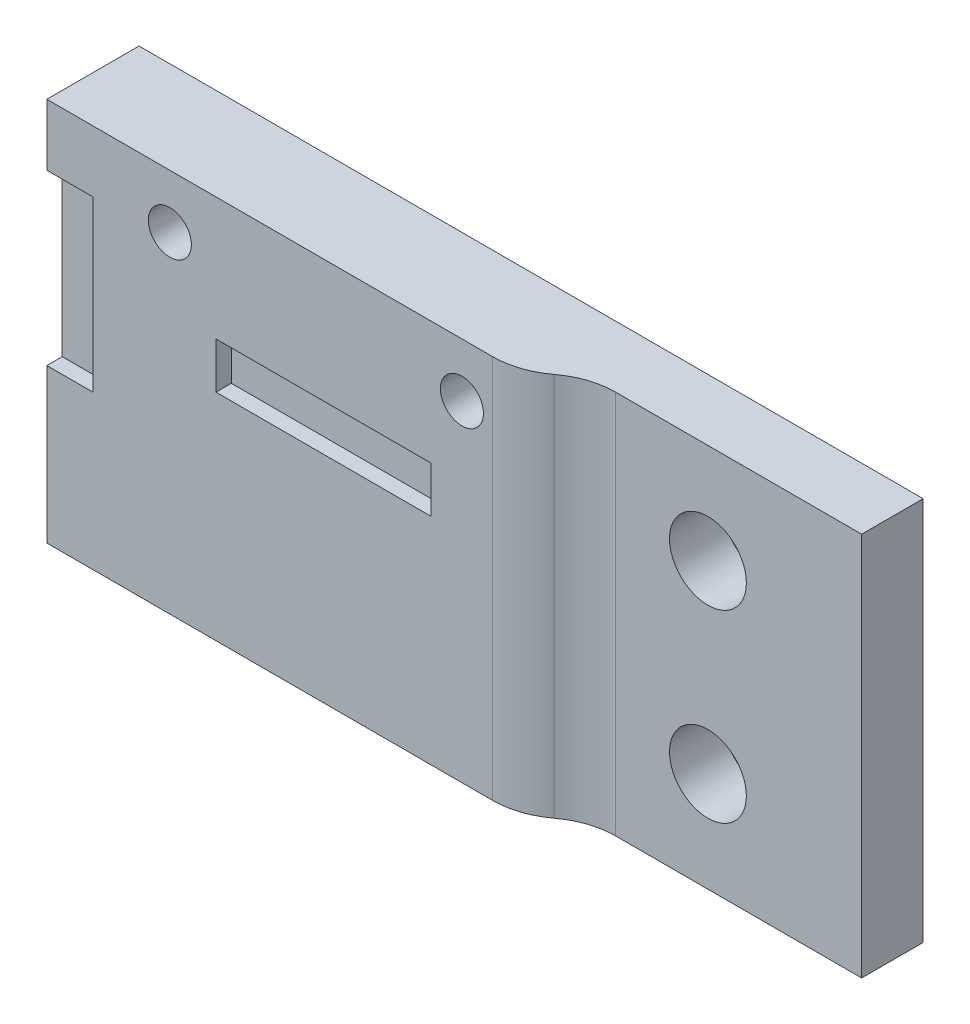
ISO-10303-21;
HEADER;
FILE_DESCRIPTION(('STEP AP214'),'2;1');
FILE_NAME('part.step','',(''),(''),'','','');
FILE_SCHEMA(('AUTOMOTIVE_DESIGN { 1 0 10303 214 1 1 1 1 }'));
ENDSEC;
DATA;
#1=APPLICATION_CONTEXT('core data for automotive mechanical design processes');
#2=APPLICATION_PROTOCOL_DEFINITION('international standard','automotive_design',2000,#1);
#3=PRODUCT_CONTEXT('',#1,'mechanical');
#4=PRODUCT('Part','Part','',(#3));
#5=PRODUCT_RELATED_PRODUCT_CATEGORY('part','',(#4));
#6=PRODUCT_DEFINITION_FORMATION('','',#4);
#7=PRODUCT_DEFINITION_CONTEXT('part definition',#1,'design');
#8=PRODUCT_DEFINITION('design','',#6,#7);
#9=PRODUCT_DEFINITION_SHAPE('','',#8);
#10=(LENGTH_UNIT() NAMED_UNIT(*) SI_UNIT(.MILLI.,.METRE.));
#11=(NAMED_UNIT(*) PLANE_ANGLE_UNIT() SI_UNIT($,.RADIAN.));
#12=(NAMED_UNIT(*) SI_UNIT($,.STERADIAN.) SOLID_ANGLE_UNIT());
#13=UNCERTAINTY_MEASURE_WITH_UNIT(LENGTH_MEASURE(1.E-05),#10,'distance_accuracy_value','');
#14=(GEOMETRIC_REPRESENTATION_CONTEXT(3) GLOBAL_UNCERTAINTY_ASSIGNED_CONTEXT((#13)) GLOBAL_UNIT_ASSIGNED_CONTEXT((#10,
#11,#12)) REPRESENTATION_CONTEXT('',''));
#15=CARTESIAN_POINT('',(0.,0.,0.));
#16=DIRECTION('',(0.,0.,1.));
#17=DIRECTION('',(1.,0.,0.));
#18=AXIS2_PLACEMENT_3D('',#15,#16,#17);
#19=CARTESIAN_POINT('',(0.,0.,0.));
#20=DIRECTION('',(0.,0.,-1.));
#21=DIRECTION('',(-1.,0.,0.));
#22=AXIS2_PLACEMENT_3D('',#19,#20,#21);
#23=PLANE('',#22);
#24=DIRECTION('',(1.,0.,0.));
#25=VECTOR('',#24,1.);
#26=CARTESIAN_POINT('',(-20.,-12.5,0.));
#27=LINE('',#26,#25);
#28=CARTESIAN_POINT('',(-11.,-12.5,0.));
#29=VERTEX_POINT('',#28);
#30=CARTESIAN_POINT('',(40.,-12.5,0.));
#31=VERTEX_POINT('',#30);
#32=EDGE_CURVE('E196',#29,#31,#27,.T.);
#33=ORIENTED_EDGE('',*,*,#32,.F.);
#34=DIRECTION('',(0.,1.,0.));
#35=VECTOR('',#34,1.);
#36=CARTESIAN_POINT('',(-11.,12.5,0.));
#37=LINE('',#36,#35);
#38=CARTESIAN_POINT('',(-11.,12.5,0.));
#39=VERTEX_POINT('',#38);
#40=EDGE_CURVE('E200',#29,#39,#37,.T.);
#41=ORIENTED_EDGE('',*,*,#40,.T.);
#42=DIRECTION('',(-1.,0.,0.));
#43=VECTOR('',#42,1.);
#44=CARTESIAN_POINT('',(-20.,12.5,0.));
#45=LINE('',#44,#43);
#46=CARTESIAN_POINT('',(40.,12.5,0.));
#47=VERTEX_POINT('',#46);
#48=EDGE_CURVE('E264',#47,#39,#45,.T.);
#49=ORIENTED_EDGE('',*,*,#48,.F.);
#50=DIRECTION('',(0.,1.,0.));
#51=VECTOR('',#50,1.);
#52=CARTESIAN_POINT('',(40.,12.5,0.));
#53=LINE('',#52,#51);
#54=EDGE_CURVE('E189',#31,#47,#53,.T.);
#55=ORIENTED_EDGE('',*,*,#54,.F.);
#56=EDGE_LOOP('',(#33,#41,#49,#55));
#57=FACE_BOUND('',#56,.T.);
#58=CARTESIAN_POINT('',(-2.99999999999997,9.,0.));
#59=DIRECTION('',(0.,0.,1.));
#60=DIRECTION('',(1.,0.,0.));
#61=AXIS2_PLACEMENT_3D('',#58,#59,#60);
#62=CIRCLE('',#61,1.4);
#63=CARTESIAN_POINT('',(-1.59999999999997,9.,0.));
#64=VERTEX_POINT('',#63);
#65=EDGE_CURVE('E228',#64,#64,#62,.T.);
#66=ORIENTED_EDGE('',*,*,#65,.T.);
#67=EDGE_LOOP('',(#66));
#68=FACE_BOUND('',#67,.T.);
#69=CARTESIAN_POINT('',(16.,9.,0.));
#70=DIRECTION('',(0.,0.,1.));
#71=DIRECTION('',(1.,0.,0.));
#72=AXIS2_PLACEMENT_3D('',#69,#70,#71);
#73=CIRCLE('',#72,1.4);
#74=CARTESIAN_POINT('',(17.4,9.,0.));
#75=VERTEX_POINT('',#74);
#76=EDGE_CURVE('E224',#75,#75,#73,.T.);
#77=ORIENTED_EDGE('',*,*,#76,.T.);
#78=EDGE_LOOP('',(#77));
#79=FACE_BOUND('',#78,.T.);
#80=CARTESIAN_POINT('',(26.4521410112089,-0.0342933799786366,0.));
#81=DIRECTION('',(0.,0.,-1.));
#82=DIRECTION('',(-1.,0.,0.));
#83=AXIS2_PLACEMENT_3D('',#80,#81,#82);
#84=CIRCLE('',#83,1.);
#85=CARTESIAN_POINT('',(26.9589780096076,0.827748531446883,0.));
#86=VERTEX_POINT('',#85);
#87=CARTESIAN_POINT('',(27.4515528202694,0.,0.));
#88=VERTEX_POINT('',#87);
#89=EDGE_CURVE('E321',#86,#88,#84,.T.);
#90=ORIENTED_EDGE('',*,*,#89,.T.);
#91=CARTESIAN_POINT('',(26.4521410112089,0.0342933799786348,0.));
#92=DIRECTION('',(0.,0.,-1.));
#93=DIRECTION('',(-1.,0.,0.));
#94=AXIS2_PLACEMENT_3D('',#91,#92,#93);
#95=CIRCLE('',#94,1.);
#96=CARTESIAN_POINT('',(26.9589780096076,-0.827748531446884,0.));
#97=VERTEX_POINT('',#96);
#98=EDGE_CURVE('E323',#88,#97,#95,.T.);
#99=ORIENTED_EDGE('',*,*,#98,.T.);
#100=CARTESIAN_POINT('',(30.,-6.,0.));
#101=DIRECTION('',(0.,0.,1.));
#102=DIRECTION('',(1.,0.,0.));
#103=AXIS2_PLACEMENT_3D('',#100,#101,#102);
#104=CIRCLE('',#103,6.);
#105=CARTESIAN_POINT('',(33.107908902421,-0.867661132168676,0.));
#106=VERTEX_POINT('',#105);
#107=EDGE_CURVE('E427',#97,#106,#104,.T.);
#108=ORIENTED_EDGE('',*,*,#107,.T.);
#109=CARTESIAN_POINT('',(33.6258937194912,-0.0122713208634525,0.));
#110=DIRECTION('',(0.,0.,-1.));
#111=DIRECTION('',(-1.,0.,0.));
#112=AXIS2_PLACEMENT_3D('',#109,#110,#111);
#113=CIRCLE('',#112,1.);
#114=CARTESIAN_POINT('',(32.6258937194912,-0.0122713208634525,0.));
#115=VERTEX_POINT('',#114);
#116=EDGE_CURVE('E319',#106,#115,#113,.T.);
#117=ORIENTED_EDGE('',*,*,#116,.T.);
#118=DIRECTION('',(0.,1.,0.));
#119=VECTOR('',#118,1.);
#120=CARTESIAN_POINT('',(32.6258937194912,0.0582838720762993,0.));
#121=LINE('',#120,#119);
#122=CARTESIAN_POINT('',(32.6258937194912,0.0122713208634533,0.));
#123=VERTEX_POINT('',#122);
#124=EDGE_CURVE('E424',#115,#123,#121,.T.);
#125=ORIENTED_EDGE('',*,*,#124,.T.);
#126=CARTESIAN_POINT('',(33.6258937194912,0.0122713208634533,0.));
#127=DIRECTION('',(0.,0.,-1.));
#128=DIRECTION('',(-1.,0.,0.));
#129=AXIS2_PLACEMENT_3D('',#126,#127,#128);
#130=CIRCLE('',#129,1.);
#131=CARTESIAN_POINT('',(33.107908902421,0.867661132168673,0.));
#132=VERTEX_POINT('',#131);
#133=EDGE_CURVE('E304',#123,#132,#130,.T.);
#134=ORIENTED_EDGE('',*,*,#133,.T.);
#135=CARTESIAN_POINT('',(30.,6.,0.));
#136=DIRECTION('',(0.,0.,1.));
#137=DIRECTION('',(1.,0.,0.));
#138=AXIS2_PLACEMENT_3D('',#135,#136,#137);
#139=CIRCLE('',#138,6.);
#140=EDGE_CURVE('E351',#132,#86,#139,.T.);
#141=ORIENTED_EDGE('',*,*,#140,.T.);
#142=EDGE_LOOP('',(#90,#99,#108,#117,#125,#134,#141));
#143=FACE_BOUND('',#142,.T.);
#144=ADVANCED_FACE('F32',(#57,#68,#79,#143),#23,.T.);
#145=CARTESIAN_POINT('',(-20.,12.5,6.));
#146=DIRECTION('',(0.,-1.,0.));
#147=DIRECTION('',(0.,0.,-1.));
#148=AXIS2_PLACEMENT_3D('',#145,#146,#147);
#149=PLANE('',#148);
#150=DIRECTION('',(-1.,0.,0.));
#151=VECTOR('',#150,1.);
#152=CARTESIAN_POINT('',(-20.,12.5,6.));
#153=LINE('',#152,#151);
#154=CARTESIAN_POINT('',(18.,12.5,6.));
#155=VERTEX_POINT('',#154);
#156=CARTESIAN_POINT('',(-11.,12.5,6.));
#157=VERTEX_POINT('',#156);
#158=EDGE_CURVE('E299',#155,#157,#153,.T.);
#159=ORIENTED_EDGE('',*,*,#158,.F.);
#160=CARTESIAN_POINT('',(18.,12.5,1.));
#161=DIRECTION('',(0.,-1.,0.));
#162=DIRECTION('',(0.,0.,-1.));
#163=AXIS2_PLACEMENT_3D('',#160,#161,#162);
#164=CIRCLE('',#163,5.);
#165=CARTESIAN_POINT('',(21.,12.5,5.));
#166=VERTEX_POINT('',#165);
#167=EDGE_CURVE('E54',#155,#166,#164,.F.);
#168=ORIENTED_EDGE('',*,*,#167,.T.);
#169=CARTESIAN_POINT('',(24.,12.5,9.));
#170=DIRECTION('',(0.,-1.,0.));
#171=DIRECTION('',(0.,0.,-1.));
#172=AXIS2_PLACEMENT_3D('',#169,#170,#171);
#173=CIRCLE('',#172,5.);
#174=CARTESIAN_POINT('',(24.,12.5,4.));
#175=VERTEX_POINT('',#174);
#176=EDGE_CURVE('E355',#166,#175,#173,.T.);
#177=ORIENTED_EDGE('',*,*,#176,.T.);
#178=DIRECTION('',(-1.,0.,0.));
#179=VECTOR('',#178,1.);
#180=CARTESIAN_POINT('',(20.,12.5,4.));
#181=LINE('',#180,#179);
#182=CARTESIAN_POINT('',(40.,12.5,4.));
#183=VERTEX_POINT('',#182);
#184=EDGE_CURVE('E206',#183,#175,#181,.T.);
#185=ORIENTED_EDGE('',*,*,#184,.F.);
#186=DIRECTION('',(0.,0.,-1.));
#187=VECTOR('',#186,1.);
#188=CARTESIAN_POINT('',(40.,12.5,4.));
#189=LINE('',#188,#187);
#190=EDGE_CURVE('E201',#183,#47,#189,.T.);
#191=ORIENTED_EDGE('',*,*,#190,.T.);
#192=ORIENTED_EDGE('',*,*,#48,.T.);
#193=DIRECTION('',(0.,0.,-1.));
#194=VECTOR('',#193,1.);
#195=CARTESIAN_POINT('',(-11.,12.5,21.));
#196=LINE('',#195,#194);
#197=EDGE_CURVE('E216',#157,#39,#196,.T.);
#198=ORIENTED_EDGE('',*,*,#197,.F.);
#199=EDGE_LOOP('',(#159,#168,#177,#185,#191,#192,#198));
#200=FACE_BOUND('',#199,.T.);
#201=ADVANCED_FACE('F369',(#200),#149,.F.);
#202=CARTESIAN_POINT('',(-20.,-12.5,6.));
#203=DIRECTION('',(0.,1.,0.));
#204=DIRECTION('',(0.,0.,1.));
#205=AXIS2_PLACEMENT_3D('',#202,#203,#204);
#206=PLANE('',#205);
#207=CARTESIAN_POINT('',(24.,-12.5,9.));
#208=DIRECTION('',(0.,1.,0.));
#209=DIRECTION('',(0.,0.,1.));
#210=AXIS2_PLACEMENT_3D('',#207,#208,#209);
#211=CIRCLE('',#210,5.);
#212=CARTESIAN_POINT('',(24.,-12.5,4.));
#213=VERTEX_POINT('',#212);
#214=CARTESIAN_POINT('',(21.,-12.5,5.));
#215=VERTEX_POINT('',#214);
#216=EDGE_CURVE('E353',#213,#215,#211,.T.);
#217=ORIENTED_EDGE('',*,*,#216,.T.);
#218=CARTESIAN_POINT('',(18.,-12.5,1.));
#219=DIRECTION('',(0.,1.,0.));
#220=DIRECTION('',(0.,0.,1.));
#221=AXIS2_PLACEMENT_3D('',#218,#219,#220);
#222=CIRCLE('',#221,5.);
#223=CARTESIAN_POINT('',(18.,-12.5,6.));
#224=VERTEX_POINT('',#223);
#225=EDGE_CURVE('E11',#215,#224,#222,.F.);
#226=ORIENTED_EDGE('',*,*,#225,.T.);
#227=DIRECTION('',(1.,0.,0.));
#228=VECTOR('',#227,1.);
#229=CARTESIAN_POINT('',(-20.,-12.5,6.));
#230=LINE('',#229,#228);
#231=CARTESIAN_POINT('',(-11.,-12.5,6.));
#232=VERTEX_POINT('',#231);
#233=EDGE_CURVE('E301',#232,#224,#230,.T.);
#234=ORIENTED_EDGE('',*,*,#233,.F.);
#235=DIRECTION('',(0.,0.,-1.));
#236=VECTOR('',#235,1.);
#237=CARTESIAN_POINT('',(-11.,-12.5,21.));
#238=LINE('',#237,#236);
#239=EDGE_CURVE('E218',#232,#29,#238,.T.);
#240=ORIENTED_EDGE('',*,*,#239,.T.);
#241=ORIENTED_EDGE('',*,*,#32,.T.);
#242=DIRECTION('',(0.,0.,-1.));
#243=VECTOR('',#242,1.);
#244=CARTESIAN_POINT('',(40.,-12.5,4.));
#245=LINE('',#244,#243);
#246=CARTESIAN_POINT('',(40.,-12.5,4.));
#247=VERTEX_POINT('',#246);
#248=EDGE_CURVE('E192',#247,#31,#245,.T.);
#249=ORIENTED_EDGE('',*,*,#248,.F.);
#250=DIRECTION('',(1.,0.,0.));
#251=VECTOR('',#250,1.);
#252=CARTESIAN_POINT('',(20.,-12.5,4.));
#253=LINE('',#252,#251);
#254=EDGE_CURVE('E179',#213,#247,#253,.T.);
#255=ORIENTED_EDGE('',*,*,#254,.F.);
#256=EDGE_LOOP('',(#217,#226,#234,#240,#241,#249,#255));
#257=FACE_BOUND('',#256,.T.);
#258=ADVANCED_FACE('F193',(#257),#206,.F.);
#259=CARTESIAN_POINT('',(0.,0.,6.));
#260=DIRECTION('',(0.,0.,-1.));
#261=DIRECTION('',(-1.,0.,0.));
#262=AXIS2_PLACEMENT_3D('',#259,#260,#261);
#263=PLANE('',#262);
#264=DIRECTION('',(0.,-1.,0.));
#265=VECTOR('',#264,1.);
#266=CARTESIAN_POINT('',(0.,0.,6.));
#267=LINE('',#266,#265);
#268=CARTESIAN_POINT('',(0.,4.5,6.));
#269=VERTEX_POINT('',#268);
#270=CARTESIAN_POINT('',(0.,1.5,6.));
#271=VERTEX_POINT('',#270);
#272=EDGE_CURVE('E253',#269,#271,#267,.T.);
#273=ORIENTED_EDGE('',*,*,#272,.F.);
#274=DIRECTION('',(-1.,0.,0.));
#275=VECTOR('',#274,1.);
#276=CARTESIAN_POINT('',(0.,4.5,6.));
#277=LINE('',#276,#275);
#278=CARTESIAN_POINT('',(14.,4.5,6.));
#279=VERTEX_POINT('',#278);
#280=EDGE_CURVE('E251',#279,#269,#277,.T.);
#281=ORIENTED_EDGE('',*,*,#280,.F.);
#282=DIRECTION('',(0.,1.,0.));
#283=VECTOR('',#282,1.);
#284=CARTESIAN_POINT('',(14.,0.,6.));
#285=LINE('',#284,#283);
#286=CARTESIAN_POINT('',(14.,1.5,6.));
#287=VERTEX_POINT('',#286);
#288=EDGE_CURVE('E241',#287,#279,#285,.T.);
#289=ORIENTED_EDGE('',*,*,#288,.F.);
#290=DIRECTION('',(1.,0.,0.));
#291=VECTOR('',#290,1.);
#292=CARTESIAN_POINT('',(0.,1.5,6.));
#293=LINE('',#292,#291);
#294=EDGE_CURVE('E257',#271,#287,#293,.T.);
#295=ORIENTED_EDGE('',*,*,#294,.F.);
#296=EDGE_LOOP('',(#273,#281,#289,#295));
#297=FACE_BOUND('',#296,.T.);
#298=CARTESIAN_POINT('',(-2.99999999999997,9.,6.));
#299=DIRECTION('',(0.,0.,-1.));
#300=DIRECTION('',(-1.,0.,0.));
#301=AXIS2_PLACEMENT_3D('',#298,#299,#300);
#302=CIRCLE('',#301,1.4);
#303=CARTESIAN_POINT('',(-4.39999999999997,9.,6.));
#304=VERTEX_POINT('',#303);
#305=EDGE_CURVE('E227',#304,#304,#302,.F.);
#306=ORIENTED_EDGE('',*,*,#305,.F.);
#307=EDGE_LOOP('',(#306));
#308=FACE_BOUND('',#307,.T.);
#309=CARTESIAN_POINT('',(16.,9.,6.));
#310=DIRECTION('',(0.,0.,-1.));
#311=DIRECTION('',(-1.,0.,0.));
#312=AXIS2_PLACEMENT_3D('',#309,#310,#311);
#313=CIRCLE('',#312,1.4);
#314=CARTESIAN_POINT('',(14.6,9.,6.));
#315=VERTEX_POINT('',#314);
#316=EDGE_CURVE('E233',#315,#315,#313,.F.);
#317=ORIENTED_EDGE('',*,*,#316,.F.);
#318=EDGE_LOOP('',(#317));
#319=FACE_BOUND('',#318,.T.);
#320=ORIENTED_EDGE('',*,*,#233,.T.);
#321=DIRECTION('',(0.,-1.,0.));
#322=VECTOR('',#321,1.);
#323=CARTESIAN_POINT('',(18.,0.,6.));
#324=LINE('',#323,#322);
#325=EDGE_CURVE('E357',#224,#155,#324,.F.);
#326=ORIENTED_EDGE('',*,*,#325,.T.);
#327=ORIENTED_EDGE('',*,*,#158,.T.);
#328=DIRECTION('',(0.,1.,0.));
#329=VECTOR('',#328,1.);
#330=CARTESIAN_POINT('',(-11.,0.,6.));
#331=LINE('',#330,#329);
#332=CARTESIAN_POINT('',(-11.,8.5,6.));
#333=VERTEX_POINT('',#332);
#334=EDGE_CURVE('E220',#333,#157,#331,.T.);
#335=ORIENTED_EDGE('',*,*,#334,.F.);
#336=DIRECTION('',(-1.,0.,0.));
#337=VECTOR('',#336,1.);
#338=CARTESIAN_POINT('',(0.,8.5,6.));
#339=LINE('',#338,#337);
#340=CARTESIAN_POINT('',(-8.,8.5,6.));
#341=VERTEX_POINT('',#340);
#342=EDGE_CURVE('E286',#341,#333,#339,.T.);
#343=ORIENTED_EDGE('',*,*,#342,.F.);
#344=DIRECTION('',(0.,1.,0.));
#345=VECTOR('',#344,1.);
#346=CARTESIAN_POINT('',(-8.,0.,6.));
#347=LINE('',#346,#345);
#348=CARTESIAN_POINT('',(-8.,-2.5,6.));
#349=VERTEX_POINT('',#348);
#350=EDGE_CURVE('E236',#349,#341,#347,.T.);
#351=ORIENTED_EDGE('',*,*,#350,.F.);
#352=DIRECTION('',(1.,0.,0.));
#353=VECTOR('',#352,1.);
#354=CARTESIAN_POINT('',(0.,-2.5,6.));
#355=LINE('',#354,#353);
#356=CARTESIAN_POINT('',(-11.,-2.5,6.));
#357=VERTEX_POINT('',#356);
#358=EDGE_CURVE('E275',#357,#349,#355,.T.);
#359=ORIENTED_EDGE('',*,*,#358,.F.);
#360=EDGE_CURVE('E223',#232,#357,#331,.T.);
#361=ORIENTED_EDGE('',*,*,#360,.F.);
#362=EDGE_LOOP('',(#320,#326,#327,#335,#343,#351,#359,#361));
#363=FACE_BOUND('',#362,.T.);
#364=ADVANCED_FACE('F362',(#297,#308,#319,#363),#263,.F.);
#365=CARTESIAN_POINT('',(-8.,0.,5.));
#366=DIRECTION('',(1.,0.,0.));
#367=DIRECTION('',(0.,1.,0.));
#368=AXIS2_PLACEMENT_3D('',#365,#366,#367);
#369=PLANE('',#368);
#370=ORIENTED_EDGE('',*,*,#350,.T.);
#371=DIRECTION('',(0.,0.,1.));
#372=VECTOR('',#371,1.);
#373=CARTESIAN_POINT('',(-8.,8.5,5.));
#374=LINE('',#373,#372);
#375=CARTESIAN_POINT('',(-8.,8.5,5.));
#376=VERTEX_POINT('',#375);
#377=EDGE_CURVE('E284',#376,#341,#374,.T.);
#378=ORIENTED_EDGE('',*,*,#377,.F.);
#379=DIRECTION('',(0.,1.,0.));
#380=VECTOR('',#379,1.);
#381=CARTESIAN_POINT('',(-8.,0.,5.));
#382=LINE('',#381,#380);
#383=CARTESIAN_POINT('',(-8.,-2.5,5.));
#384=VERTEX_POINT('',#383);
#385=EDGE_CURVE('E271',#384,#376,#382,.T.);
#386=ORIENTED_EDGE('',*,*,#385,.F.);
#387=DIRECTION('',(0.,0.,1.));
#388=VECTOR('',#387,1.);
#389=CARTESIAN_POINT('',(-8.,-2.5,5.));
#390=LINE('',#389,#388);
#391=EDGE_CURVE('E254',#384,#349,#390,.T.);
#392=ORIENTED_EDGE('',*,*,#391,.T.);
#393=EDGE_LOOP('',(#370,#378,#386,#392));
#394=FACE_BOUND('',#393,.T.);
#395=ADVANCED_FACE('F494',(#394),#369,.F.);
#396=CARTESIAN_POINT('',(0.,-2.5,5.));
#397=DIRECTION('',(0.,-1.,0.));
#398=DIRECTION('',(0.,0.,-1.));
#399=AXIS2_PLACEMENT_3D('',#396,#397,#398);
#400=PLANE('',#399);
#401=ORIENTED_EDGE('',*,*,#358,.T.);
#402=ORIENTED_EDGE('',*,*,#391,.F.);
#403=DIRECTION('',(1.,0.,0.));
#404=VECTOR('',#403,1.);
#405=CARTESIAN_POINT('',(0.,-2.5,5.));
#406=LINE('',#405,#404);
#407=CARTESIAN_POINT('',(-11.,-2.5,5.));
#408=VERTEX_POINT('',#407);
#409=EDGE_CURVE('E281',#408,#384,#406,.T.);
#410=ORIENTED_EDGE('',*,*,#409,.F.);
#411=DIRECTION('',(0.,0.,1.));
#412=VECTOR('',#411,1.);
#413=CARTESIAN_POINT('',(-11.,-2.5,5.));
#414=LINE('',#413,#412);
#415=EDGE_CURVE('E292',#408,#357,#414,.T.);
#416=ORIENTED_EDGE('',*,*,#415,.T.);
#417=EDGE_LOOP('',(#401,#402,#410,#416));
#418=FACE_BOUND('',#417,.T.);
#419=ADVANCED_FACE('F491',(#418),#400,.F.);
#420=CARTESIAN_POINT('',(0.,8.5,5.));
#421=DIRECTION('',(0.,1.,0.));
#422=DIRECTION('',(0.,0.,1.));
#423=AXIS2_PLACEMENT_3D('',#420,#421,#422);
#424=PLANE('',#423);
#425=ORIENTED_EDGE('',*,*,#342,.T.);
#426=DIRECTION('',(0.,0.,1.));
#427=VECTOR('',#426,1.);
#428=CARTESIAN_POINT('',(-11.,8.5,5.));
#429=LINE('',#428,#427);
#430=CARTESIAN_POINT('',(-11.,8.5,5.));
#431=VERTEX_POINT('',#430);
#432=EDGE_CURVE('E295',#431,#333,#429,.T.);
#433=ORIENTED_EDGE('',*,*,#432,.F.);
#434=DIRECTION('',(-1.,0.,0.));
#435=VECTOR('',#434,1.);
#436=CARTESIAN_POINT('',(0.,8.5,5.));
#437=LINE('',#436,#435);
#438=EDGE_CURVE('E274',#376,#431,#437,.T.);
#439=ORIENTED_EDGE('',*,*,#438,.F.);
#440=ORIENTED_EDGE('',*,*,#377,.T.);
#441=EDGE_LOOP('',(#425,#433,#439,#440));
#442=FACE_BOUND('',#441,.T.);
#443=ADVANCED_FACE('F489',(#442),#424,.F.);
#444=CARTESIAN_POINT('',(0.,0.,5.));
#445=DIRECTION('',(0.,0.,1.));
#446=DIRECTION('',(1.,0.,0.));
#447=AXIS2_PLACEMENT_3D('',#444,#445,#446);
#448=PLANE('',#447);
#449=ORIENTED_EDGE('',*,*,#385,.T.);
#450=ORIENTED_EDGE('',*,*,#438,.T.);
#451=DIRECTION('',(0.,-1.,0.));
#452=VECTOR('',#451,1.);
#453=CARTESIAN_POINT('',(-11.,0.,5.));
#454=LINE('',#453,#452);
#455=EDGE_CURVE('E278',#431,#408,#454,.T.);
#456=ORIENTED_EDGE('',*,*,#455,.T.);
#457=ORIENTED_EDGE('',*,*,#409,.T.);
#458=EDGE_LOOP('',(#449,#450,#456,#457));
#459=FACE_BOUND('',#458,.T.);
#460=ADVANCED_FACE('F485',(#459),#448,.T.);
#461=CARTESIAN_POINT('',(0.,4.5,5.));
#462=DIRECTION('',(0.,1.,0.));
#463=DIRECTION('',(0.,0.,1.));
#464=AXIS2_PLACEMENT_3D('',#461,#462,#463);
#465=PLANE('',#464);
#466=ORIENTED_EDGE('',*,*,#280,.T.);
#467=DIRECTION('',(0.,0.,1.));
#468=VECTOR('',#467,1.);
#469=CARTESIAN_POINT('',(0.,4.5,5.));
#470=LINE('',#469,#468);
#471=CARTESIAN_POINT('',(0.,4.5,5.));
#472=VERTEX_POINT('',#471);
#473=EDGE_CURVE('E250',#472,#269,#470,.T.);
#474=ORIENTED_EDGE('',*,*,#473,.F.);
#475=DIRECTION('',(-1.,0.,0.));
#476=VECTOR('',#475,1.);
#477=CARTESIAN_POINT('',(0.,4.5,5.));
#478=LINE('',#477,#476);
#479=CARTESIAN_POINT('',(14.,4.5,5.));
#480=VERTEX_POINT('',#479);
#481=EDGE_CURVE('E237',#480,#472,#478,.T.);
#482=ORIENTED_EDGE('',*,*,#481,.F.);
#483=DIRECTION('',(0.,0.,1.));
#484=VECTOR('',#483,1.);
#485=CARTESIAN_POINT('',(14.,4.5,5.));
#486=LINE('',#485,#484);
#487=EDGE_CURVE('E262',#480,#279,#486,.T.);
#488=ORIENTED_EDGE('',*,*,#487,.T.);
#489=EDGE_LOOP('',(#466,#474,#482,#488));
#490=FACE_BOUND('',#489,.T.);
#491=ADVANCED_FACE('F475',(#490),#465,.F.);
#492=CARTESIAN_POINT('',(14.,0.,5.));
#493=DIRECTION('',(1.,0.,0.));
#494=DIRECTION('',(0.,0.,-1.));
#495=AXIS2_PLACEMENT_3D('',#492,#493,#494);
#496=PLANE('',#495);
#497=ORIENTED_EDGE('',*,*,#288,.T.);
#498=ORIENTED_EDGE('',*,*,#487,.F.);
#499=DIRECTION('',(0.,1.,0.));
#500=VECTOR('',#499,1.);
#501=CARTESIAN_POINT('',(14.,0.,5.));
#502=LINE('',#501,#500);
#503=CARTESIAN_POINT('',(14.,1.5,5.));
#504=VERTEX_POINT('',#503);
#505=EDGE_CURVE('E247',#504,#480,#502,.T.);
#506=ORIENTED_EDGE('',*,*,#505,.F.);
#507=DIRECTION('',(0.,0.,1.));
#508=VECTOR('',#507,1.);
#509=CARTESIAN_POINT('',(14.,1.5,5.));
#510=LINE('',#509,#508);
#511=EDGE_CURVE('E265',#504,#287,#510,.T.);
#512=ORIENTED_EDGE('',*,*,#511,.T.);
#513=EDGE_LOOP('',(#497,#498,#506,#512));
#514=FACE_BOUND('',#513,.T.);
#515=ADVANCED_FACE('F471',(#514),#496,.F.);
#516=CARTESIAN_POINT('',(0.,1.5,5.));
#517=DIRECTION('',(0.,-1.,0.));
#518=DIRECTION('',(0.,0.,-1.));
#519=AXIS2_PLACEMENT_3D('',#516,#517,#518);
#520=PLANE('',#519);
#521=ORIENTED_EDGE('',*,*,#294,.T.);
#522=ORIENTED_EDGE('',*,*,#511,.F.);
#523=DIRECTION('',(1.,0.,0.));
#524=VECTOR('',#523,1.);
#525=CARTESIAN_POINT('',(0.,1.5,5.));
#526=LINE('',#525,#524);
#527=CARTESIAN_POINT('',(0.,1.5,5.));
#528=VERTEX_POINT('',#527);
#529=EDGE_CURVE('E244',#528,#504,#526,.T.);
#530=ORIENTED_EDGE('',*,*,#529,.F.);
#531=DIRECTION('',(0.,0.,1.));
#532=VECTOR('',#531,1.);
#533=CARTESIAN_POINT('',(0.,1.5,5.));
#534=LINE('',#533,#532);
#535=EDGE_CURVE('E267',#528,#271,#534,.T.);
#536=ORIENTED_EDGE('',*,*,#535,.T.);
#537=EDGE_LOOP('',(#521,#522,#530,#536));
#538=FACE_BOUND('',#537,.T.);
#539=ADVANCED_FACE('F474',(#538),#520,.F.);
#540=CARTESIAN_POINT('',(0.,0.,5.));
#541=DIRECTION('',(-1.,0.,0.));
#542=DIRECTION('',(0.,0.,1.));
#543=AXIS2_PLACEMENT_3D('',#540,#541,#542);
#544=PLANE('',#543);
#545=ORIENTED_EDGE('',*,*,#272,.T.);
#546=ORIENTED_EDGE('',*,*,#535,.F.);
#547=DIRECTION('',(0.,-1.,0.));
#548=VECTOR('',#547,1.);
#549=CARTESIAN_POINT('',(0.,0.,5.));
#550=LINE('',#549,#548);
#551=EDGE_CURVE('E240',#472,#528,#550,.T.);
#552=ORIENTED_EDGE('',*,*,#551,.F.);
#553=ORIENTED_EDGE('',*,*,#473,.T.);
#554=EDGE_LOOP('',(#545,#546,#552,#553));
#555=FACE_BOUND('',#554,.T.);
#556=ADVANCED_FACE('F469',(#555),#544,.F.);
#557=CARTESIAN_POINT('',(0.,0.,5.));
#558=DIRECTION('',(0.,0.,1.));
#559=DIRECTION('',(1.,0.,0.));
#560=AXIS2_PLACEMENT_3D('',#557,#558,#559);
#561=PLANE('',#560);
#562=ORIENTED_EDGE('',*,*,#481,.T.);
#563=ORIENTED_EDGE('',*,*,#551,.T.);
#564=ORIENTED_EDGE('',*,*,#529,.T.);
#565=ORIENTED_EDGE('',*,*,#505,.T.);
#566=EDGE_LOOP('',(#562,#563,#564,#565));
#567=FACE_BOUND('',#566,.T.);
#568=ADVANCED_FACE('F465',(#567),#561,.T.);
#569=CARTESIAN_POINT('',(-2.99999999999997,9.,11.));
#570=DIRECTION('',(0.,0.,-1.));
#571=DIRECTION('',(-1.,0.,0.));
#572=AXIS2_PLACEMENT_3D('',#569,#570,#571);
#573=CYLINDRICAL_SURFACE('',#572,1.4);
#574=ORIENTED_EDGE('',*,*,#65,.F.);
#575=EDGE_LOOP('',(#574));
#576=FACE_BOUND('',#575,.T.);
#577=ORIENTED_EDGE('',*,*,#305,.T.);
#578=EDGE_LOOP('',(#577));
#579=FACE_BOUND('',#578,.T.);
#580=ADVANCED_FACE('F461',(#576,#579),#573,.F.);
#581=CARTESIAN_POINT('',(16.,9.,11.));
#582=DIRECTION('',(0.,0.,-1.));
#583=DIRECTION('',(-1.,0.,0.));
#584=AXIS2_PLACEMENT_3D('',#581,#582,#583);
#585=CYLINDRICAL_SURFACE('',#584,1.4);
#586=ORIENTED_EDGE('',*,*,#76,.F.);
#587=EDGE_LOOP('',(#586));
#588=FACE_BOUND('',#587,.T.);
#589=ORIENTED_EDGE('',*,*,#316,.T.);
#590=EDGE_LOOP('',(#589));
#591=FACE_BOUND('',#590,.T.);
#592=ADVANCED_FACE('F458',(#588,#591),#585,.F.);
#593=CARTESIAN_POINT('',(-11.,12.5,21.));
#594=DIRECTION('',(-1.,0.,0.));
#595=DIRECTION('',(0.,-1.,0.));
#596=AXIS2_PLACEMENT_3D('',#593,#594,#595);
#597=PLANE('',#596);
#598=ORIENTED_EDGE('',*,*,#360,.T.);
#599=ORIENTED_EDGE('',*,*,#415,.F.);
#600=ORIENTED_EDGE('',*,*,#455,.F.);
#601=ORIENTED_EDGE('',*,*,#432,.T.);
#602=ORIENTED_EDGE('',*,*,#334,.T.);
#603=ORIENTED_EDGE('',*,*,#197,.T.);
#604=ORIENTED_EDGE('',*,*,#40,.F.);
#605=ORIENTED_EDGE('',*,*,#239,.F.);
#606=EDGE_LOOP('',(#598,#599,#600,#601,#602,#603,#604,#605));
#607=FACE_BOUND('',#606,.T.);
#608=ADVANCED_FACE('F371',(#607),#597,.T.);
#609=CARTESIAN_POINT('',(40.,12.5,4.));
#610=DIRECTION('',(-1.,0.,0.));
#611=DIRECTION('',(0.,0.,1.));
#612=AXIS2_PLACEMENT_3D('',#609,#610,#611);
#613=PLANE('',#612);
#614=ORIENTED_EDGE('',*,*,#54,.T.);
#615=ORIENTED_EDGE('',*,*,#190,.F.);
#616=DIRECTION('',(0.,1.,0.));
#617=VECTOR('',#616,1.);
#618=CARTESIAN_POINT('',(40.,12.5,4.));
#619=LINE('',#618,#617);
#620=EDGE_CURVE('E184',#247,#183,#619,.T.);
#621=ORIENTED_EDGE('',*,*,#620,.F.);
#622=ORIENTED_EDGE('',*,*,#248,.T.);
#623=EDGE_LOOP('',(#614,#615,#621,#622));
#624=FACE_BOUND('',#623,.T.);
#625=ADVANCED_FACE('F203',(#624),#613,.F.);
#626=CARTESIAN_POINT('',(0.,0.,4.));
#627=DIRECTION('',(0.,0.,1.));
#628=DIRECTION('',(1.,0.,0.));
#629=AXIS2_PLACEMENT_3D('',#626,#627,#628);
#630=PLANE('',#629);
#631=CARTESIAN_POINT('',(30.,6.,4.));
#632=DIRECTION('',(0.,0.,1.));
#633=DIRECTION('',(1.,0.,0.));
#634=AXIS2_PLACEMENT_3D('',#631,#632,#633);
#635=CIRCLE('',#634,2.49999999999999);
#636=CARTESIAN_POINT('',(32.5,6.,4.));
#637=VERTEX_POINT('',#636);
#638=EDGE_CURVE('E212',#637,#637,#635,.F.);
#639=ORIENTED_EDGE('',*,*,#638,.T.);
#640=EDGE_LOOP('',(#639));
#641=FACE_BOUND('',#640,.T.);
#642=CARTESIAN_POINT('',(30.,-6.,4.));
#643=DIRECTION('',(0.,0.,1.));
#644=DIRECTION('',(1.,0.,0.));
#645=AXIS2_PLACEMENT_3D('',#642,#643,#644);
#646=CIRCLE('',#645,2.5);
#647=CARTESIAN_POINT('',(32.5,-6.,4.));
#648=VERTEX_POINT('',#647);
#649=EDGE_CURVE('E308',#648,#648,#646,.F.);
#650=ORIENTED_EDGE('',*,*,#649,.T.);
#651=EDGE_LOOP('',(#650));
#652=FACE_BOUND('',#651,.T.);
#653=ORIENTED_EDGE('',*,*,#184,.T.);
#654=DIRECTION('',(0.,1.,0.));
#655=VECTOR('',#654,1.);
#656=CARTESIAN_POINT('',(24.,-12.5,4.));
#657=LINE('',#656,#655);
#658=EDGE_CURVE('E187',#175,#213,#657,.F.);
#659=ORIENTED_EDGE('',*,*,#658,.T.);
#660=ORIENTED_EDGE('',*,*,#254,.T.);
#661=ORIENTED_EDGE('',*,*,#620,.T.);
#662=EDGE_LOOP('',(#653,#659,#660,#661));
#663=FACE_BOUND('',#662,.T.);
#664=ADVANCED_FACE('F182',(#641,#652,#663),#630,.T.);
#665=CARTESIAN_POINT('',(30.,-6.,6.));
#666=DIRECTION('',(0.,0.,-1.));
#667=DIRECTION('',(-1.,0.,0.));
#668=AXIS2_PLACEMENT_3D('',#665,#666,#667);
#669=CYLINDRICAL_SURFACE('',#668,2.5);
#670=CARTESIAN_POINT('',(30.,-6.,0.5));
#671=DIRECTION('',(0.,0.,1.));
#672=DIRECTION('',(1.,0.,0.));
#673=AXIS2_PLACEMENT_3D('',#670,#671,#672);
#674=CIRCLE('',#673,2.5);
#675=CARTESIAN_POINT('',(32.5,-6.,0.5));
#676=VERTEX_POINT('',#675);
#677=EDGE_CURVE('E311',#676,#676,#674,.T.);
#678=ORIENTED_EDGE('',*,*,#677,.F.);
#679=EDGE_LOOP('',(#678));
#680=FACE_BOUND('',#679,.T.);
#681=ORIENTED_EDGE('',*,*,#649,.F.);
#682=EDGE_LOOP('',(#681));
#683=FACE_BOUND('',#682,.T.);
#684=ADVANCED_FACE('F440',(#680,#683),#669,.F.);
#685=CARTESIAN_POINT('',(30.,6.,6.));
#686=DIRECTION('',(0.,0.,-1.));
#687=DIRECTION('',(-1.,0.,0.));
#688=AXIS2_PLACEMENT_3D('',#685,#686,#687);
#689=CYLINDRICAL_SURFACE('',#688,2.49999999999999);
#690=CARTESIAN_POINT('',(30.,6.,0.5));
#691=DIRECTION('',(0.,0.,1.));
#692=DIRECTION('',(1.,0.,0.));
#693=AXIS2_PLACEMENT_3D('',#690,#691,#692);
#694=CIRCLE('',#693,2.49999999999999);
#695=CARTESIAN_POINT('',(32.5,6.,0.5));
#696=VERTEX_POINT('',#695);
#697=EDGE_CURVE('E314',#696,#696,#694,.T.);
#698=ORIENTED_EDGE('',*,*,#697,.F.);
#699=EDGE_LOOP('',(#698));
#700=FACE_BOUND('',#699,.T.);
#701=ORIENTED_EDGE('',*,*,#638,.F.);
#702=EDGE_LOOP('',(#701));
#703=FACE_BOUND('',#702,.T.);
#704=ADVANCED_FACE('F443',(#700,#703),#689,.F.);
#705=CARTESIAN_POINT('',(30.,6.,0.5));
#706=DIRECTION('',(0.,0.,-1.));
#707=DIRECTION('',(-1.,0.,0.));
#708=AXIS2_PLACEMENT_3D('',#705,#706,#707);
#709=CYLINDRICAL_SURFACE('',#708,6.);
#710=CARTESIAN_POINT('',(30.,6.,0.5));
#711=DIRECTION('',(0.,0.,1.));
#712=DIRECTION('',(1.,0.,0.));
#713=AXIS2_PLACEMENT_3D('',#710,#711,#712);
#714=CIRCLE('',#713,6.);
#715=CARTESIAN_POINT('',(33.107908902421,0.867661132168673,0.5));
#716=VERTEX_POINT('',#715);
#717=CARTESIAN_POINT('',(26.9589780096076,0.827748531446883,0.5));
#718=VERTEX_POINT('',#717);
#719=EDGE_CURVE('E418',#716,#718,#714,.T.);
#720=ORIENTED_EDGE('',*,*,#719,.T.);
#721=DIRECTION('',(0.,0.,-1.));
#722=VECTOR('',#721,1.);
#723=CARTESIAN_POINT('',(26.9589780096076,0.827748531446882,0.5));
#724=LINE('',#723,#722);
#725=EDGE_CURVE('E333',#718,#86,#724,.T.);
#726=ORIENTED_EDGE('',*,*,#725,.T.);
#727=ORIENTED_EDGE('',*,*,#140,.F.);
#728=DIRECTION('',(0.,0.,-1.));
#729=VECTOR('',#728,1.);
#730=CARTESIAN_POINT('',(33.107908902421,0.867661132168672,0.5));
#731=LINE('',#730,#729);
#732=EDGE_CURVE('E331',#132,#716,#731,.F.);
#733=ORIENTED_EDGE('',*,*,#732,.T.);
#734=EDGE_LOOP('',(#720,#726,#727,#733));
#735=FACE_BOUND('',#734,.T.);
#736=ADVANCED_FACE('F594',(#735),#709,.F.);
#737=CARTESIAN_POINT('',(30.,-6.,0.5));
#738=DIRECTION('',(0.,0.,-1.));
#739=DIRECTION('',(-1.,0.,0.));
#740=AXIS2_PLACEMENT_3D('',#737,#738,#739);
#741=CYLINDRICAL_SURFACE('',#740,6.);
#742=ORIENTED_EDGE('',*,*,#107,.F.);
#743=DIRECTION('',(0.,0.,-1.));
#744=VECTOR('',#743,1.);
#745=CARTESIAN_POINT('',(26.9589780096076,-0.827748531446884,0.5));
#746=LINE('',#745,#744);
#747=CARTESIAN_POINT('',(26.9589780096076,-0.827748531446884,0.5));
#748=VERTEX_POINT('',#747);
#749=EDGE_CURVE('E328',#97,#748,#746,.F.);
#750=ORIENTED_EDGE('',*,*,#749,.T.);
#751=CARTESIAN_POINT('',(30.,-6.,0.5));
#752=DIRECTION('',(0.,0.,1.));
#753=DIRECTION('',(1.,0.,0.));
#754=AXIS2_PLACEMENT_3D('',#751,#752,#753);
#755=CIRCLE('',#754,6.);
#756=CARTESIAN_POINT('',(33.107908902421,-0.867661132168676,0.5));
#757=VERTEX_POINT('',#756);
#758=EDGE_CURVE('E317',#748,#757,#755,.T.);
#759=ORIENTED_EDGE('',*,*,#758,.T.);
#760=DIRECTION('',(0.,0.,-1.));
#761=VECTOR('',#760,1.);
#762=CARTESIAN_POINT('',(33.107908902421,-0.867661132168676,0.5));
#763=LINE('',#762,#761);
#764=EDGE_CURVE('E325',#757,#106,#763,.T.);
#765=ORIENTED_EDGE('',*,*,#764,.T.);
#766=EDGE_LOOP('',(#742,#750,#759,#765));
#767=FACE_BOUND('',#766,.T.);
#768=ADVANCED_FACE('F584',(#767),#741,.F.);
#769=CARTESIAN_POINT('',(32.6258937194912,0.0582838720762993,0.5));
#770=DIRECTION('',(-1.,0.,0.));
#771=DIRECTION('',(0.,0.,1.));
#772=AXIS2_PLACEMENT_3D('',#769,#770,#771);
#773=PLANE('',#772);
#774=ORIENTED_EDGE('',*,*,#124,.F.);
#775=DIRECTION('',(0.,0.,-1.));
#776=VECTOR('',#775,1.);
#777=CARTESIAN_POINT('',(32.6258937194912,-0.0122713208634525,0.5));
#778=LINE('',#777,#776);
#779=CARTESIAN_POINT('',(32.6258937194912,-0.0122713208634525,0.5));
#780=VERTEX_POINT('',#779);
#781=EDGE_CURVE('E338',#115,#780,#778,.F.);
#782=ORIENTED_EDGE('',*,*,#781,.T.);
#783=DIRECTION('',(0.,1.,0.));
#784=VECTOR('',#783,1.);
#785=CARTESIAN_POINT('',(32.6258937194912,0.0582838720762993,0.5));
#786=LINE('',#785,#784);
#787=CARTESIAN_POINT('',(32.6258937194912,0.0122713208634533,0.5));
#788=VERTEX_POINT('',#787);
#789=EDGE_CURVE('E415',#780,#788,#786,.T.);
#790=ORIENTED_EDGE('',*,*,#789,.T.);
#791=DIRECTION('',(0.,0.,-1.));
#792=VECTOR('',#791,1.);
#793=CARTESIAN_POINT('',(32.6258937194912,0.0122713208634533,0.5));
#794=LINE('',#793,#792);
#795=EDGE_CURVE('E335',#788,#123,#794,.T.);
#796=ORIENTED_EDGE('',*,*,#795,.T.);
#797=EDGE_LOOP('',(#774,#782,#790,#796));
#798=FACE_BOUND('',#797,.T.);
#799=ADVANCED_FACE('F421',(#798),#773,.T.);
#800=CARTESIAN_POINT('',(30.,6.,0.5));
#801=DIRECTION('',(0.,0.,1.));
#802=DIRECTION('',(1.,0.,0.));
#803=AXIS2_PLACEMENT_3D('',#800,#801,#802);
#804=PLANE('',#803);
#805=ORIENTED_EDGE('',*,*,#677,.T.);
#806=EDGE_LOOP('',(#805));
#807=FACE_BOUND('',#806,.T.);
#808=ORIENTED_EDGE('',*,*,#697,.T.);
#809=EDGE_LOOP('',(#808));
#810=FACE_BOUND('',#809,.T.);
#811=ORIENTED_EDGE('',*,*,#789,.F.);
#812=CARTESIAN_POINT('',(33.6258937194912,-0.0122713208634525,0.5));
#813=DIRECTION('',(0.,0.,1.));
#814=DIRECTION('',(1.,0.,0.));
#815=AXIS2_PLACEMENT_3D('',#812,#813,#814);
#816=CIRCLE('',#815,1.);
#817=EDGE_CURVE('E344',#780,#757,#816,.T.);
#818=ORIENTED_EDGE('',*,*,#817,.T.);
#819=ORIENTED_EDGE('',*,*,#758,.F.);
#820=CARTESIAN_POINT('',(26.4521410112089,0.0342933799786348,0.5));
#821=DIRECTION('',(0.,0.,1.));
#822=DIRECTION('',(1.,0.,0.));
#823=AXIS2_PLACEMENT_3D('',#820,#821,#822);
#824=CIRCLE('',#823,1.);
#825=CARTESIAN_POINT('',(27.4515528202694,0.,0.5));
#826=VERTEX_POINT('',#825);
#827=EDGE_CURVE('E340',#748,#826,#824,.T.);
#828=ORIENTED_EDGE('',*,*,#827,.T.);
#829=CARTESIAN_POINT('',(26.4521410112089,-0.0342933799786366,0.5));
#830=DIRECTION('',(0.,0.,1.));
#831=DIRECTION('',(1.,0.,0.));
#832=AXIS2_PLACEMENT_3D('',#829,#830,#831);
#833=CIRCLE('',#832,1.);
#834=EDGE_CURVE('E342',#826,#718,#833,.T.);
#835=ORIENTED_EDGE('',*,*,#834,.T.);
#836=ORIENTED_EDGE('',*,*,#719,.F.);
#837=CARTESIAN_POINT('',(33.6258937194912,0.0122713208634533,0.5));
#838=DIRECTION('',(0.,0.,1.));
#839=DIRECTION('',(1.,0.,0.));
#840=AXIS2_PLACEMENT_3D('',#837,#838,#839);
#841=CIRCLE('',#840,1.);
#842=EDGE_CURVE('E346',#716,#788,#841,.T.);
#843=ORIENTED_EDGE('',*,*,#842,.T.);
#844=EDGE_LOOP('',(#811,#818,#819,#828,#835,#836,#843));
#845=FACE_BOUND('',#844,.T.);
#846=ADVANCED_FACE('F399',(#807,#810,#845),#804,.F.);
#847=CARTESIAN_POINT('',(26.4521410112089,-0.0342933799786366,0.5));
#848=DIRECTION('',(0.,0.,-1.));
#849=DIRECTION('',(-1.,0.,0.));
#850=AXIS2_PLACEMENT_3D('',#847,#848,#849);
#851=CYLINDRICAL_SURFACE('',#850,1.);
#852=ORIENTED_EDGE('',*,*,#725,.F.);
#853=ORIENTED_EDGE('',*,*,#834,.F.);
#854=DIRECTION('',(0.,0.,-1.));
#855=VECTOR('',#854,1.);
#856=CARTESIAN_POINT('',(27.4515528202694,0.,0.25));
#857=LINE('',#856,#855);
#858=EDGE_CURVE('E348',#88,#826,#857,.F.);
#859=ORIENTED_EDGE('',*,*,#858,.F.);
#860=ORIENTED_EDGE('',*,*,#89,.F.);
#861=EDGE_LOOP('',(#852,#853,#859,#860));
#862=FACE_BOUND('',#861,.T.);
#863=ADVANCED_FACE('F395',(#862),#851,.T.);
#864=CARTESIAN_POINT('',(26.4521410112089,0.0342933799786348,0.5));
#865=DIRECTION('',(0.,0.,-1.));
#866=DIRECTION('',(-1.,0.,0.));
#867=AXIS2_PLACEMENT_3D('',#864,#865,#866);
#868=CYLINDRICAL_SURFACE('',#867,1.);
#869=ORIENTED_EDGE('',*,*,#827,.F.);
#870=ORIENTED_EDGE('',*,*,#749,.F.);
#871=ORIENTED_EDGE('',*,*,#98,.F.);
#872=ORIENTED_EDGE('',*,*,#858,.T.);
#873=EDGE_LOOP('',(#869,#870,#871,#872));
#874=FACE_BOUND('',#873,.T.);
#875=ADVANCED_FACE('F391',(#874),#868,.T.);
#876=CARTESIAN_POINT('',(33.6258937194912,-0.0122713208634525,0.5));
#877=DIRECTION('',(0.,0.,-1.));
#878=DIRECTION('',(-1.,0.,0.));
#879=AXIS2_PLACEMENT_3D('',#876,#877,#878);
#880=CYLINDRICAL_SURFACE('',#879,1.);
#881=ORIENTED_EDGE('',*,*,#817,.F.);
#882=ORIENTED_EDGE('',*,*,#781,.F.);
#883=ORIENTED_EDGE('',*,*,#116,.F.);
#884=ORIENTED_EDGE('',*,*,#764,.F.);
#885=EDGE_LOOP('',(#881,#882,#883,#884));
#886=FACE_BOUND('',#885,.T.);
#887=ADVANCED_FACE('F394',(#886),#880,.T.);
#888=CARTESIAN_POINT('',(33.6258937194912,0.0122713208634533,0.5));
#889=DIRECTION('',(0.,0.,-1.));
#890=DIRECTION('',(-1.,0.,0.));
#891=AXIS2_PLACEMENT_3D('',#888,#889,#890);
#892=CYLINDRICAL_SURFACE('',#891,1.);
#893=ORIENTED_EDGE('',*,*,#842,.F.);
#894=ORIENTED_EDGE('',*,*,#732,.F.);
#895=ORIENTED_EDGE('',*,*,#133,.F.);
#896=ORIENTED_EDGE('',*,*,#795,.F.);
#897=EDGE_LOOP('',(#893,#894,#895,#896));
#898=FACE_BOUND('',#897,.T.);
#899=ADVANCED_FACE('F379',(#898),#892,.T.);
#900=CARTESIAN_POINT('',(24.,-12.5,9.));
#901=DIRECTION('',(0.,-1.,0.));
#902=DIRECTION('',(0.,0.,-1.));
#903=AXIS2_PLACEMENT_3D('',#900,#901,#902);
#904=CYLINDRICAL_SURFACE('',#903,5.);
#905=ORIENTED_EDGE('',*,*,#176,.F.);
#906=DIRECTION('',(0.,-1.,0.));
#907=VECTOR('',#906,1.);
#908=CARTESIAN_POINT('',(21.,-12.5,5.));
#909=LINE('',#908,#907);
#910=EDGE_CURVE('E40',#166,#215,#909,.T.);
#911=ORIENTED_EDGE('',*,*,#910,.T.);
#912=ORIENTED_EDGE('',*,*,#216,.F.);
#913=ORIENTED_EDGE('',*,*,#658,.F.);
#914=EDGE_LOOP('',(#905,#911,#912,#913));
#915=FACE_BOUND('',#914,.T.);
#916=ADVANCED_FACE('F374',(#915),#904,.F.);
#917=CARTESIAN_POINT('',(18.,-12.5,1.));
#918=DIRECTION('',(0.,-1.,0.));
#919=DIRECTION('',(0.,0.,-1.));
#920=AXIS2_PLACEMENT_3D('',#917,#918,#919);
#921=CYLINDRICAL_SURFACE('',#920,5.);
#922=ORIENTED_EDGE('',*,*,#225,.F.);
#923=ORIENTED_EDGE('',*,*,#910,.F.);
#924=ORIENTED_EDGE('',*,*,#167,.F.);
#925=ORIENTED_EDGE('',*,*,#325,.F.);
#926=EDGE_LOOP('',(#922,#923,#924,#925));
#927=FACE_BOUND('',#926,.T.);
#928=ADVANCED_FACE('F34',(#927),#921,.T.);
#929=CLOSED_SHELL('',(#144,#201,#258,#364,#395,#419,#443,#460,#491,#515,#539,#556,#568,#580,
#592,#608,#625,#664,#684,#704,#736,#768,#799,#846,#863,#875,#887,#899,#916,#928));
#930=MANIFOLD_SOLID_BREP('B2',#929);
#931=ADVANCED_BREP_SHAPE_REPRESENTATION('',(#18,#930),#14);
#932=SHAPE_DEFINITION_REPRESENTATION(#9,#931);
ENDSEC;
END-ISO-10303-21;
